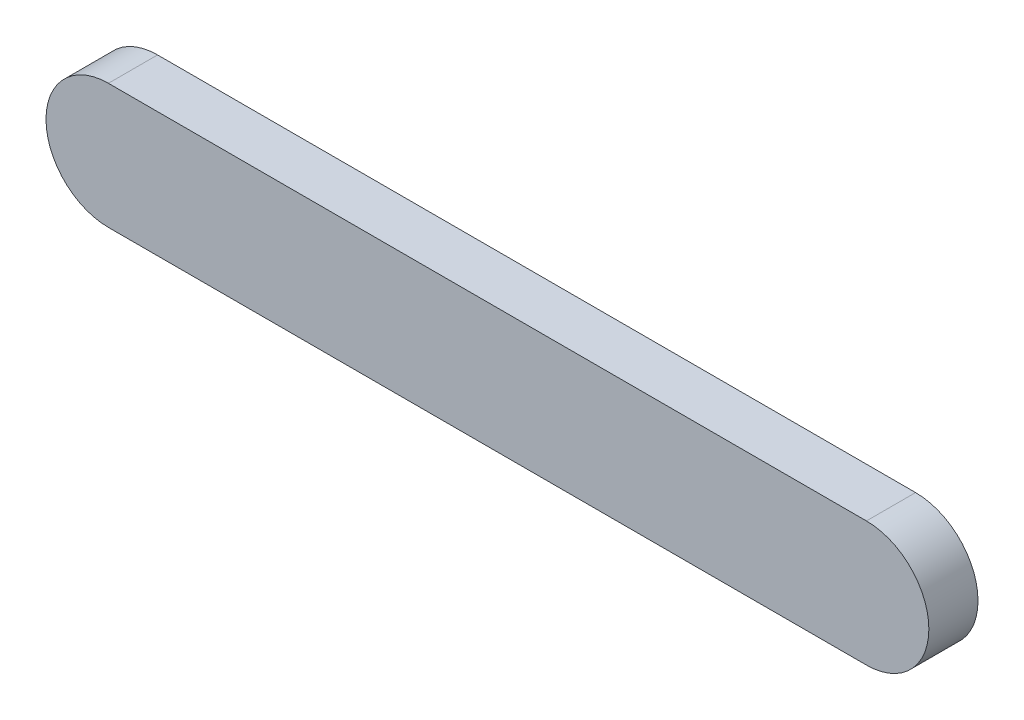
ISO-10303-21;
HEADER;
FILE_DESCRIPTION(('STEP AP214'),'2;1');
FILE_NAME('part.step','',(''),(''),'','','');
FILE_SCHEMA(('AUTOMOTIVE_DESIGN { 1 0 10303 214 1 1 1 1 }'));
ENDSEC;
DATA;
#1=APPLICATION_CONTEXT('core data for automotive mechanical design processes');
#2=APPLICATION_PROTOCOL_DEFINITION('international standard','automotive_design',2000,#1);
#3=PRODUCT_CONTEXT('',#1,'mechanical');
#4=PRODUCT('Part','Part','',(#3));
#5=PRODUCT_RELATED_PRODUCT_CATEGORY('part','',(#4));
#6=PRODUCT_DEFINITION_FORMATION('','',#4);
#7=PRODUCT_DEFINITION_CONTEXT('part definition',#1,'design');
#8=PRODUCT_DEFINITION('design','',#6,#7);
#9=PRODUCT_DEFINITION_SHAPE('','',#8);
#10=(LENGTH_UNIT() NAMED_UNIT(*) SI_UNIT(.MILLI.,.METRE.));
#11=(NAMED_UNIT(*) PLANE_ANGLE_UNIT() SI_UNIT($,.RADIAN.));
#12=(NAMED_UNIT(*) SI_UNIT($,.STERADIAN.) SOLID_ANGLE_UNIT());
#13=UNCERTAINTY_MEASURE_WITH_UNIT(LENGTH_MEASURE(1.E-05),#10,'distance_accuracy_value','');
#14=(GEOMETRIC_REPRESENTATION_CONTEXT(3) GLOBAL_UNCERTAINTY_ASSIGNED_CONTEXT((#13)) GLOBAL_UNIT_ASSIGNED_CONTEXT((#10,
#11,#12)) REPRESENTATION_CONTEXT('',''));
#15=CARTESIAN_POINT('',(0.,0.,0.));
#16=DIRECTION('',(0.,0.,1.));
#17=DIRECTION('',(1.,0.,0.));
#18=AXIS2_PLACEMENT_3D('',#15,#16,#17);
#19=CARTESIAN_POINT('',(138.7602,56.3118,0.));
#20=DIRECTION('',(0.,1.,0.));
#21=DIRECTION('',(1.,0.,0.));
#22=AXIS2_PLACEMENT_3D('',#19,#20,#21);
#23=PLANE('',#22);
#24=DIRECTION('',(1.,0.,0.));
#25=VECTOR('',#24,1.);
#26=CARTESIAN_POINT('',(138.7602,56.3118,0.1999996));
#27=LINE('',#26,#25);
#28=CARTESIAN_POINT('',(138.7602,56.3118,0.1999996));
#29=VERTEX_POINT('',#28);
#30=CARTESIAN_POINT('',(141.8447252,56.3118,0.1999996));
#31=VERTEX_POINT('',#30);
#32=EDGE_CURVE('E11',#29,#31,#27,.T.);
#33=ORIENTED_EDGE('',*,*,#32,.F.);
#34=DIRECTION('',(0.,0.,1.));
#35=VECTOR('',#34,1.);
#36=CARTESIAN_POINT('',(138.7602,56.3118,0.));
#37=LINE('',#36,#35);
#38=CARTESIAN_POINT('',(138.7602,56.3118,0.));
#39=VERTEX_POINT('',#38);
#40=EDGE_CURVE('E24',#39,#29,#37,.T.);
#41=ORIENTED_EDGE('',*,*,#40,.F.);
#42=DIRECTION('',(1.,0.,0.));
#43=VECTOR('',#42,1.);
#44=CARTESIAN_POINT('',(138.7602,56.3118,0.));
#45=LINE('',#44,#43);
#46=CARTESIAN_POINT('',(141.8447252,56.3118,0.));
#47=VERTEX_POINT('',#46);
#48=EDGE_CURVE('E75',#39,#47,#45,.T.);
#49=ORIENTED_EDGE('',*,*,#48,.T.);
#50=DIRECTION('',(0.,0.,1.));
#51=VECTOR('',#50,1.);
#52=CARTESIAN_POINT('',(141.8447252,56.3118,0.));
#53=LINE('',#52,#51);
#54=EDGE_CURVE('E37',#47,#31,#53,.T.);
#55=ORIENTED_EDGE('',*,*,#54,.T.);
#56=EDGE_LOOP('',(#33,#41,#49,#55));
#57=FACE_BOUND('',#56,.T.);
#58=ADVANCED_FACE('F17',(#57),#23,.F.);
#59=CARTESIAN_POINT('',(141.8447252,56.5658,0.));
#60=DIRECTION('',(0.,0.,-1.));
#61=DIRECTION('',(1.11896493820486E-13,-1.,0.));
#62=AXIS2_PLACEMENT_3D('',#59,#60,#61);
#63=CYLINDRICAL_SURFACE('',#62,0.254000000000007);
#64=CARTESIAN_POINT('',(141.8447252,56.5658,0.1999996));
#65=DIRECTION('',(0.,0.,1.));
#66=DIRECTION('',(1.11896493820486E-13,-1.,0.));
#67=AXIS2_PLACEMENT_3D('',#64,#65,#66);
#68=CIRCLE('',#67,0.254000000000007);
#69=CARTESIAN_POINT('',(141.8447252,56.8198,0.1999996));
#70=VERTEX_POINT('',#69);
#71=EDGE_CURVE('E83',#31,#70,#68,.T.);
#72=ORIENTED_EDGE('',*,*,#71,.F.);
#73=ORIENTED_EDGE('',*,*,#54,.F.);
#74=CARTESIAN_POINT('',(141.8447252,56.5658,0.));
#75=DIRECTION('',(0.,0.,1.));
#76=DIRECTION('',(1.11896493820486E-13,-1.,0.));
#77=AXIS2_PLACEMENT_3D('',#74,#75,#76);
#78=CIRCLE('',#77,0.254000000000007);
#79=CARTESIAN_POINT('',(141.8447252,56.8198,0.));
#80=VERTEX_POINT('',#79);
#81=EDGE_CURVE('E81',#47,#80,#78,.T.);
#82=ORIENTED_EDGE('',*,*,#81,.T.);
#83=DIRECTION('',(0.,0.,1.));
#84=VECTOR('',#83,1.);
#85=CARTESIAN_POINT('',(141.8447252,56.8198,0.));
#86=LINE('',#85,#84);
#87=EDGE_CURVE('E67',#80,#70,#86,.T.);
#88=ORIENTED_EDGE('',*,*,#87,.T.);
#89=EDGE_LOOP('',(#72,#73,#82,#88));
#90=FACE_BOUND('',#89,.T.);
#91=ADVANCED_FACE('F89',(#90),#63,.T.);
#92=CARTESIAN_POINT('',(141.8447252,56.8198,0.));
#93=DIRECTION('',(0.,-1.,0.));
#94=DIRECTION('',(-1.,0.,0.));
#95=AXIS2_PLACEMENT_3D('',#92,#93,#94);
#96=PLANE('',#95);
#97=DIRECTION('',(-1.,0.,0.));
#98=VECTOR('',#97,1.);
#99=CARTESIAN_POINT('',(141.8447252,56.8198,0.1999996));
#100=LINE('',#99,#98);
#101=CARTESIAN_POINT('',(138.7602,56.8198,0.1999996));
#102=VERTEX_POINT('',#101);
#103=EDGE_CURVE('E71',#70,#102,#100,.T.);
#104=ORIENTED_EDGE('',*,*,#103,.F.);
#105=ORIENTED_EDGE('',*,*,#87,.F.);
#106=DIRECTION('',(-1.,0.,0.));
#107=VECTOR('',#106,1.);
#108=CARTESIAN_POINT('',(141.8447252,56.8198,0.));
#109=LINE('',#108,#107);
#110=CARTESIAN_POINT('',(138.7602,56.8198,0.));
#111=VERTEX_POINT('',#110);
#112=EDGE_CURVE('E63',#80,#111,#109,.T.);
#113=ORIENTED_EDGE('',*,*,#112,.T.);
#114=DIRECTION('',(0.,0.,1.));
#115=VECTOR('',#114,1.);
#116=CARTESIAN_POINT('',(138.7602,56.8198,0.));
#117=LINE('',#116,#115);
#118=EDGE_CURVE('E53',#111,#102,#117,.T.);
#119=ORIENTED_EDGE('',*,*,#118,.T.);
#120=EDGE_LOOP('',(#104,#105,#113,#119));
#121=FACE_BOUND('',#120,.T.);
#122=ADVANCED_FACE('F66',(#121),#96,.F.);
#123=CARTESIAN_POINT('',(138.7602,56.5658,0.));
#124=DIRECTION('',(0.,0.,-1.));
#125=DIRECTION('',(0.,1.,0.));
#126=AXIS2_PLACEMENT_3D('',#123,#124,#125);
#127=CYLINDRICAL_SURFACE('',#126,0.253999999999998);
#128=CARTESIAN_POINT('',(138.7602,56.5658,0.1999996));
#129=DIRECTION('',(0.,0.,1.));
#130=DIRECTION('',(0.,1.,0.));
#131=AXIS2_PLACEMENT_3D('',#128,#129,#130);
#132=CIRCLE('',#131,0.253999999999998);
#133=EDGE_CURVE('E59',#102,#29,#132,.T.);
#134=ORIENTED_EDGE('',*,*,#133,.F.);
#135=ORIENTED_EDGE('',*,*,#118,.F.);
#136=CARTESIAN_POINT('',(138.7602,56.5658,0.));
#137=DIRECTION('',(0.,0.,1.));
#138=DIRECTION('',(0.,1.,0.));
#139=AXIS2_PLACEMENT_3D('',#136,#137,#138);
#140=CIRCLE('',#139,0.253999999999998);
#141=EDGE_CURVE('E57',#111,#39,#140,.T.);
#142=ORIENTED_EDGE('',*,*,#141,.T.);
#143=ORIENTED_EDGE('',*,*,#40,.T.);
#144=EDGE_LOOP('',(#134,#135,#142,#143));
#145=FACE_BOUND('',#144,.T.);
#146=ADVANCED_FACE('F55',(#145),#127,.T.);
#147=CARTESIAN_POINT('',(138.7602,56.3118,0.));
#148=DIRECTION('',(0.,0.,-1.));
#149=DIRECTION('',(-1.,0.,0.));
#150=AXIS2_PLACEMENT_3D('',#147,#148,#149);
#151=PLANE('',#150);
#152=ORIENTED_EDGE('',*,*,#141,.F.);
#153=ORIENTED_EDGE('',*,*,#112,.F.);
#154=ORIENTED_EDGE('',*,*,#81,.F.);
#155=ORIENTED_EDGE('',*,*,#48,.F.);
#156=EDGE_LOOP('',(#152,#153,#154,#155));
#157=FACE_BOUND('',#156,.T.);
#158=ADVANCED_FACE('F74',(#157),#151,.T.);
#159=CARTESIAN_POINT('',(138.7602,56.3118,0.1999996));
#160=DIRECTION('',(0.,0.,-1.));
#161=DIRECTION('',(-1.,0.,0.));
#162=AXIS2_PLACEMENT_3D('',#159,#160,#161);
#163=PLANE('',#162);
#164=ORIENTED_EDGE('',*,*,#32,.T.);
#165=ORIENTED_EDGE('',*,*,#71,.T.);
#166=ORIENTED_EDGE('',*,*,#103,.T.);
#167=ORIENTED_EDGE('',*,*,#133,.T.);
#168=EDGE_LOOP('',(#164,#165,#166,#167));
#169=FACE_BOUND('',#168,.T.);
#170=ADVANCED_FACE('F91',(#169),#163,.F.);
#171=CLOSED_SHELL('',(#58,#91,#122,#146,#158,#170));
#172=MANIFOLD_SOLID_BREP('B1',#171);
#173=ADVANCED_BREP_SHAPE_REPRESENTATION('',(#18,#172),#14);
#174=SHAPE_DEFINITION_REPRESENTATION(#9,#173);
ENDSEC;
END-ISO-10303-21;
